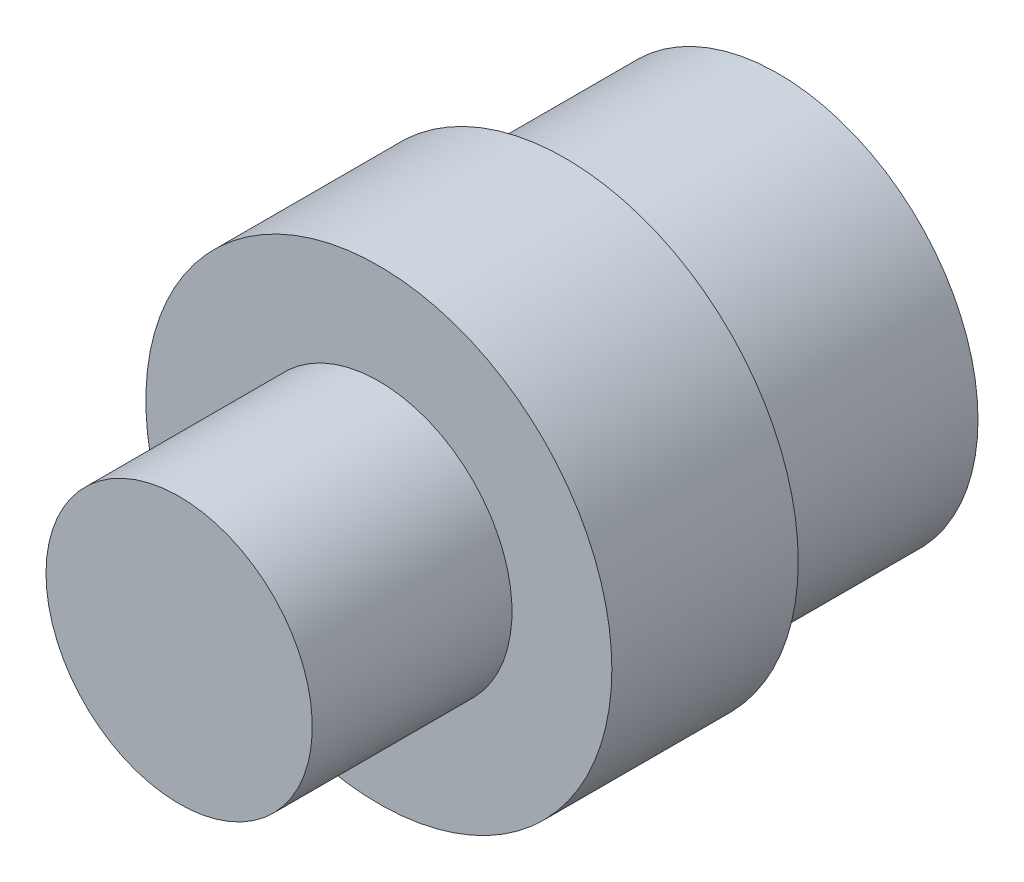
ISO-10303-21;
HEADER;
FILE_DESCRIPTION(('STEP AP214'),'2;1');
FILE_NAME('part.step','',(''),(''),'','','');
FILE_SCHEMA(('AUTOMOTIVE_DESIGN { 1 0 10303 214 1 1 1 1 }'));
ENDSEC;
DATA;
#1=APPLICATION_CONTEXT('core data for automotive mechanical design processes');
#2=APPLICATION_PROTOCOL_DEFINITION('international standard','automotive_design',2000,#1);
#3=PRODUCT_CONTEXT('',#1,'mechanical');
#4=PRODUCT('Part','Part','',(#3));
#5=PRODUCT_RELATED_PRODUCT_CATEGORY('part','',(#4));
#6=PRODUCT_DEFINITION_FORMATION('','',#4);
#7=PRODUCT_DEFINITION_CONTEXT('part definition',#1,'design');
#8=PRODUCT_DEFINITION('design','',#6,#7);
#9=PRODUCT_DEFINITION_SHAPE('','',#8);
#10=(LENGTH_UNIT() NAMED_UNIT(*) SI_UNIT(.MILLI.,.METRE.));
#11=(NAMED_UNIT(*) PLANE_ANGLE_UNIT() SI_UNIT($,.RADIAN.));
#12=(NAMED_UNIT(*) SI_UNIT($,.STERADIAN.) SOLID_ANGLE_UNIT());
#13=UNCERTAINTY_MEASURE_WITH_UNIT(LENGTH_MEASURE(1.E-05),#10,'distance_accuracy_value','');
#14=(GEOMETRIC_REPRESENTATION_CONTEXT(3) GLOBAL_UNCERTAINTY_ASSIGNED_CONTEXT((#13)) GLOBAL_UNIT_ASSIGNED_CONTEXT((#10,
#11,#12)) REPRESENTATION_CONTEXT('',''));
#15=CARTESIAN_POINT('',(0.,0.,0.));
#16=DIRECTION('',(0.,0.,1.));
#17=DIRECTION('',(1.,0.,0.));
#18=AXIS2_PLACEMENT_3D('',#15,#16,#17);
#19=CARTESIAN_POINT('',(0.,0.,9.525));
#20=DIRECTION('',(0.,0.,-1.));
#21=DIRECTION('',(-1.,0.,0.));
#22=AXIS2_PLACEMENT_3D('',#19,#20,#21);
#23=CYLINDRICAL_SURFACE('',#22,6.35);
#24=CARTESIAN_POINT('',(0.,0.,9.525));
#25=DIRECTION('',(0.,0.,1.));
#26=DIRECTION('',(1.,0.,0.));
#27=AXIS2_PLACEMENT_3D('',#24,#25,#26);
#28=CIRCLE('',#27,6.35);
#29=CARTESIAN_POINT('',(-6.35,0.,9.525));
#30=VERTEX_POINT('',#29);
#31=EDGE_CURVE('E50',#30,#30,#28,.T.);
#32=CARTESIAN_POINT('',(0.,0.,0.));
#33=DIRECTION('',(0.,0.,-1.));
#34=DIRECTION('',(-1.,0.,0.));
#35=AXIS2_PLACEMENT_3D('',#32,#33,#34);
#36=CIRCLE('',#35,6.35);
#37=CARTESIAN_POINT('',(-6.35,0.,0.));
#38=VERTEX_POINT('',#37);
#39=EDGE_CURVE('E54',#38,#38,#36,.T.);
#40=CARTESIAN_POINT('',(-6.35,0.,9.525));
#41=CARTESIAN_POINT('',(-6.35,0.,9.42578125));
#42=CARTESIAN_POINT('',(-6.35,0.,9.3265625));
#43=CARTESIAN_POINT('',(-6.35,0.,9.128125));
#44=CARTESIAN_POINT('',(-6.35,0.,9.02890625));
#45=CARTESIAN_POINT('',(-6.35,0.,8.83046875));
#46=CARTESIAN_POINT('',(-6.35,0.,8.73125));
#47=CARTESIAN_POINT('',(-6.35,0.,8.5328125));
#48=CARTESIAN_POINT('',(-6.35,0.,8.43359375));
#49=CARTESIAN_POINT('',(-6.35,0.,8.23515625));
#50=CARTESIAN_POINT('',(-6.35,0.,8.1359375));
#51=CARTESIAN_POINT('',(-6.35,0.,7.9375));
#52=CARTESIAN_POINT('',(-6.35,0.,7.83828125));
#53=CARTESIAN_POINT('',(-6.35,0.,7.63984375));
#54=CARTESIAN_POINT('',(-6.35,0.,7.540625));
#55=CARTESIAN_POINT('',(-6.35,0.,7.3421875));
#56=CARTESIAN_POINT('',(-6.35,0.,7.24296875));
#57=CARTESIAN_POINT('',(-6.35,0.,7.04453125));
#58=CARTESIAN_POINT('',(-6.35,0.,6.9453125));
#59=CARTESIAN_POINT('',(-6.35,0.,6.746875));
#60=CARTESIAN_POINT('',(-6.35,0.,6.64765625));
#61=CARTESIAN_POINT('',(-6.35,0.,6.44921875));
#62=CARTESIAN_POINT('',(-6.35,0.,6.35));
#63=CARTESIAN_POINT('',(-6.35,0.,6.1515625));
#64=CARTESIAN_POINT('',(-6.35,0.,6.05234375));
#65=CARTESIAN_POINT('',(-6.35,0.,5.85390625));
#66=CARTESIAN_POINT('',(-6.35,0.,5.7546875));
#67=CARTESIAN_POINT('',(-6.35,0.,5.55625));
#68=CARTESIAN_POINT('',(-6.35,0.,5.45703125));
#69=CARTESIAN_POINT('',(-6.35,0.,5.25859375));
#70=CARTESIAN_POINT('',(-6.35,0.,5.159375));
#71=CARTESIAN_POINT('',(-6.35,0.,4.9609375));
#72=CARTESIAN_POINT('',(-6.35,0.,4.86171875));
#73=CARTESIAN_POINT('',(-6.35,0.,4.66328125));
#74=CARTESIAN_POINT('',(-6.35,0.,4.5640625));
#75=CARTESIAN_POINT('',(-6.35,0.,4.365625));
#76=CARTESIAN_POINT('',(-6.35,0.,4.26640625));
#77=CARTESIAN_POINT('',(-6.35,0.,4.06796875));
#78=CARTESIAN_POINT('',(-6.35,0.,3.96875));
#79=CARTESIAN_POINT('',(-6.35,0.,3.7703125));
#80=CARTESIAN_POINT('',(-6.35,0.,3.67109375));
#81=CARTESIAN_POINT('',(-6.35,0.,3.47265625));
#82=CARTESIAN_POINT('',(-6.35,0.,3.3734375));
#83=CARTESIAN_POINT('',(-6.35,0.,3.175));
#84=CARTESIAN_POINT('',(-6.35,0.,3.07578125));
#85=CARTESIAN_POINT('',(-6.35,0.,2.87734375));
#86=CARTESIAN_POINT('',(-6.35,0.,2.778125));
#87=CARTESIAN_POINT('',(-6.35,0.,2.5796875));
#88=CARTESIAN_POINT('',(-6.35,0.,2.48046875));
#89=CARTESIAN_POINT('',(-6.35,0.,2.28203125));
#90=CARTESIAN_POINT('',(-6.35,0.,2.1828125));
#91=CARTESIAN_POINT('',(-6.35,0.,1.984375));
#92=CARTESIAN_POINT('',(-6.35,0.,1.88515625));
#93=CARTESIAN_POINT('',(-6.35,0.,1.68671875));
#94=CARTESIAN_POINT('',(-6.35,0.,1.5875));
#95=CARTESIAN_POINT('',(-6.35,0.,1.3890625));
#96=CARTESIAN_POINT('',(-6.35,0.,1.28984375));
#97=CARTESIAN_POINT('',(-6.35,0.,1.09140625));
#98=CARTESIAN_POINT('',(-6.35,0.,0.992187500000001));
#99=CARTESIAN_POINT('',(-6.35,0.,0.793750000000001));
#100=CARTESIAN_POINT('',(-6.35,0.,0.69453125));
#101=CARTESIAN_POINT('',(-6.35,0.,0.49609375));
#102=CARTESIAN_POINT('',(-6.35,0.,0.396875));
#103=CARTESIAN_POINT('',(-6.35,0.,0.1984375));
#104=CARTESIAN_POINT('',(-6.35,0.,0.0992187500000001));
#105=CARTESIAN_POINT('',(-6.35,0.,0.));
#106=B_SPLINE_CURVE_WITH_KNOTS('',3,(#40,#41,#42,#43,#44,#45,#46,#47,#48,#49,#50,#51,#52,#53,
#54,#55,#56,#57,#58,#59,#60,#61,#62,#63,#64,#65,#66,#67,#68,#69,#70,#71,#72,#73,#74,#75,#76,#77,
#78,#79,#80,#81,#82,#83,#84,#85,#86,#87,#88,#89,#90,#91,#92,#93,#94,#95,#96,#97,#98,#99,#100,
#101,#102,#103,#104,#105),.UNSPECIFIED.,.F.,.F.,(4,2,2,2,2,2,2,2,2,2,2,2,2,2,2,2,2,2,2,2,2,2,2,
2,2,2,2,2,2,2,2,2,4),(0.,0.297656249999998,0.595312499999999,0.892968749999999,1.190625,
1.48828125,1.7859375,2.08359375,2.38125,2.67890625,2.9765625,3.27421875,3.571875,3.86953125,
4.1671875,4.46484375,4.7625,5.06015625,5.3578125,5.65546875,5.953125,6.25078125,6.5484375,
6.84609375,7.14375,7.44140625,7.7390625,8.03671875,8.334375,8.63203125,8.9296875,9.22734375,
9.525),.UNSPECIFIED.);
#107=EDGE_CURVE('BSEAM44',#30,#38,#106,.T.);
#108=ORIENTED_EDGE('',*,*,#31,.F.);
#109=ORIENTED_EDGE('',*,*,#39,.F.);
#110=ORIENTED_EDGE('',*,*,#107,.T.);
#111=ORIENTED_EDGE('',*,*,#107,.F.);
#112=EDGE_LOOP('',(#108,#110,#109,#111));
#113=FACE_BOUND('',#112,.T.);
#114=ADVANCED_FACE('F44',(#113),#23,.T.);
#115=CARTESIAN_POINT('',(0.,0.,9.525));
#116=DIRECTION('',(0.,0.,1.));
#117=DIRECTION('',(1.,0.,0.));
#118=AXIS2_PLACEMENT_3D('',#115,#116,#117);
#119=PLANE('',#118);
#120=ORIENTED_EDGE('',*,*,#31,.T.);
#121=EDGE_LOOP('',(#120));
#122=FACE_BOUND('',#121,.T.);
#123=ADVANCED_FACE('F89',(#122),#119,.T.);
#124=CARTESIAN_POINT('',(0.,0.,0.));
#125=DIRECTION('',(0.,0.,-1.));
#126=DIRECTION('',(-1.,0.,0.));
#127=AXIS2_PLACEMENT_3D('',#124,#125,#126);
#128=PLANE('',#127);
#129=ORIENTED_EDGE('',*,*,#39,.T.);
#130=EDGE_LOOP('',(#129));
#131=FACE_BOUND('',#130,.T.);
#132=CARTESIAN_POINT('',(0.,0.,0.));
#133=DIRECTION('',(0.,0.,1.));
#134=DIRECTION('',(1.,0.,0.));
#135=AXIS2_PLACEMENT_3D('',#132,#133,#134);
#136=CIRCLE('',#135,11.1125);
#137=CARTESIAN_POINT('',(11.1125,0.,0.));
#138=VERTEX_POINT('',#137);
#139=EDGE_CURVE('E66',#138,#138,#136,.T.);
#140=ORIENTED_EDGE('',*,*,#139,.T.);
#141=EDGE_LOOP('',(#140));
#142=FACE_BOUND('',#141,.T.);
#143=ADVANCED_FACE('F70',(#131,#142),#128,.F.);
#144=CARTESIAN_POINT('',(0.,0.,-8.89));
#145=DIRECTION('',(0.,0.,1.));
#146=DIRECTION('',(1.,0.,0.));
#147=AXIS2_PLACEMENT_3D('',#144,#145,#146);
#148=PLANE('',#147);
#149=CARTESIAN_POINT('',(0.,0.,-8.89));
#150=DIRECTION('',(0.,0.,1.));
#151=DIRECTION('',(1.,0.,0.));
#152=AXIS2_PLACEMENT_3D('',#149,#150,#151);
#153=CIRCLE('',#152,11.1125);
#154=CARTESIAN_POINT('',(11.1125,0.,-8.89));
#155=VERTEX_POINT('',#154);
#156=EDGE_CURVE('E63',#155,#155,#153,.T.);
#157=ORIENTED_EDGE('',*,*,#156,.F.);
#158=EDGE_LOOP('',(#157));
#159=FACE_BOUND('',#158,.T.);
#160=CARTESIAN_POINT('',(0.,0.,-8.89));
#161=DIRECTION('',(0.,0.,1.));
#162=DIRECTION('',(1.,0.,0.));
#163=AXIS2_PLACEMENT_3D('',#160,#161,#162);
#164=CIRCLE('',#163,9.525);
#165=CARTESIAN_POINT('',(9.525,0.,-8.89));
#166=VERTEX_POINT('',#165);
#167=EDGE_CURVE('E12',#166,#166,#164,.T.);
#168=ORIENTED_EDGE('',*,*,#167,.T.);
#169=EDGE_LOOP('',(#168));
#170=FACE_BOUND('',#169,.T.);
#171=ADVANCED_FACE('F75',(#159,#170),#148,.F.);
#172=CARTESIAN_POINT('',(0.,0.,-8.89));
#173=DIRECTION('',(0.,0.,1.));
#174=DIRECTION('',(1.,0.,0.));
#175=AXIS2_PLACEMENT_3D('',#172,#173,#174);
#176=CYLINDRICAL_SURFACE('',#175,11.1125);
#177=ORIENTED_EDGE('',*,*,#156,.T.);
#178=EDGE_LOOP('',(#177));
#179=FACE_BOUND('',#178,.T.);
#180=ORIENTED_EDGE('',*,*,#139,.F.);
#181=EDGE_LOOP('',(#180));
#182=FACE_BOUND('',#181,.T.);
#183=ADVANCED_FACE('F72',(#179,#182),#176,.T.);
#184=CARTESIAN_POINT('',(0.,0.,-19.05));
#185=DIRECTION('',(0.,0.,-1.));
#186=DIRECTION('',(-1.,0.,0.));
#187=AXIS2_PLACEMENT_3D('',#184,#185,#186);
#188=PLANE('',#187);
#189=CARTESIAN_POINT('',(0.,0.,-19.05));
#190=DIRECTION('',(0.,0.,-1.));
#191=DIRECTION('',(-1.,0.,0.));
#192=AXIS2_PLACEMENT_3D('',#189,#190,#191);
#193=CIRCLE('',#192,9.525);
#194=CARTESIAN_POINT('',(9.525,0.,-19.05));
#195=VERTEX_POINT('',#194);
#196=EDGE_CURVE('E58',#195,#195,#193,.T.);
#197=ORIENTED_EDGE('',*,*,#196,.T.);
#198=EDGE_LOOP('',(#197));
#199=FACE_BOUND('',#198,.T.);
#200=ADVANCED_FACE('F74',(#199),#188,.T.);
#201=CARTESIAN_POINT('',(0.,0.,-19.05));
#202=DIRECTION('',(0.,0.,1.));
#203=DIRECTION('',(1.,0.,0.));
#204=AXIS2_PLACEMENT_3D('',#201,#202,#203);
#205=CYLINDRICAL_SURFACE('',#204,9.525);
#206=CARTESIAN_POINT('',(9.525,0.,-19.05));
#207=CARTESIAN_POINT('',(9.525,0.,-18.9441666666667));
#208=CARTESIAN_POINT('',(9.525,0.,-18.8383333333333));
#209=CARTESIAN_POINT('',(9.525,0.,-18.6266666666667));
#210=CARTESIAN_POINT('',(9.525,0.,-18.5208333333333));
#211=CARTESIAN_POINT('',(9.525,0.,-18.3091666666667));
#212=CARTESIAN_POINT('',(9.525,0.,-18.2033333333333));
#213=CARTESIAN_POINT('',(9.525,0.,-17.9916666666667));
#214=CARTESIAN_POINT('',(9.525,0.,-17.8858333333333));
#215=CARTESIAN_POINT('',(9.525,0.,-17.6741666666667));
#216=CARTESIAN_POINT('',(9.525,0.,-17.5683333333333));
#217=CARTESIAN_POINT('',(9.525,0.,-17.3566666666667));
#218=CARTESIAN_POINT('',(9.525,0.,-17.2508333333333));
#219=CARTESIAN_POINT('',(9.525,0.,-17.0391666666667));
#220=CARTESIAN_POINT('',(9.525,0.,-16.9333333333333));
#221=CARTESIAN_POINT('',(9.525,0.,-16.7216666666667));
#222=CARTESIAN_POINT('',(9.525,0.,-16.6158333333333));
#223=CARTESIAN_POINT('',(9.525,0.,-16.4041666666667));
#224=CARTESIAN_POINT('',(9.525,0.,-16.2983333333333));
#225=CARTESIAN_POINT('',(9.525,0.,-16.0866666666667));
#226=CARTESIAN_POINT('',(9.525,0.,-15.9808333333333));
#227=CARTESIAN_POINT('',(9.525,0.,-15.7691666666667));
#228=CARTESIAN_POINT('',(9.525,0.,-15.6633333333333));
#229=CARTESIAN_POINT('',(9.525,0.,-15.4516666666667));
#230=CARTESIAN_POINT('',(9.525,0.,-15.3458333333333));
#231=CARTESIAN_POINT('',(9.525,0.,-15.1341666666667));
#232=CARTESIAN_POINT('',(9.525,0.,-15.0283333333333));
#233=CARTESIAN_POINT('',(9.525,0.,-14.8166666666667));
#234=CARTESIAN_POINT('',(9.525,0.,-14.7108333333333));
#235=CARTESIAN_POINT('',(9.525,0.,-14.4991666666667));
#236=CARTESIAN_POINT('',(9.525,0.,-14.3933333333333));
#237=CARTESIAN_POINT('',(9.525,0.,-14.1816666666667));
#238=CARTESIAN_POINT('',(9.525,0.,-14.0758333333333));
#239=CARTESIAN_POINT('',(9.525,0.,-13.8641666666667));
#240=CARTESIAN_POINT('',(9.525,0.,-13.7583333333333));
#241=CARTESIAN_POINT('',(9.525,0.,-13.5466666666667));
#242=CARTESIAN_POINT('',(9.525,0.,-13.4408333333333));
#243=CARTESIAN_POINT('',(9.525,0.,-13.2291666666667));
#244=CARTESIAN_POINT('',(9.525,0.,-13.1233333333333));
#245=CARTESIAN_POINT('',(9.525,0.,-12.9116666666667));
#246=CARTESIAN_POINT('',(9.525,0.,-12.8058333333333));
#247=CARTESIAN_POINT('',(9.525,0.,-12.5941666666667));
#248=CARTESIAN_POINT('',(9.525,0.,-12.4883333333333));
#249=CARTESIAN_POINT('',(9.525,0.,-12.2766666666667));
#250=CARTESIAN_POINT('',(9.525,0.,-12.1708333333333));
#251=CARTESIAN_POINT('',(9.525,0.,-11.9591666666667));
#252=CARTESIAN_POINT('',(9.525,0.,-11.8533333333333));
#253=CARTESIAN_POINT('',(9.525,0.,-11.6416666666667));
#254=CARTESIAN_POINT('',(9.525,0.,-11.5358333333333));
#255=CARTESIAN_POINT('',(9.525,0.,-11.3241666666667));
#256=CARTESIAN_POINT('',(9.525,0.,-11.2183333333333));
#257=CARTESIAN_POINT('',(9.525,0.,-11.0066666666667));
#258=CARTESIAN_POINT('',(9.525,0.,-10.9008333333333));
#259=CARTESIAN_POINT('',(9.525,0.,-10.6891666666667));
#260=CARTESIAN_POINT('',(9.525,0.,-10.5833333333333));
#261=CARTESIAN_POINT('',(9.525,0.,-10.3716666666667));
#262=CARTESIAN_POINT('',(9.525,0.,-10.2658333333333));
#263=CARTESIAN_POINT('',(9.525,0.,-10.0541666666667));
#264=CARTESIAN_POINT('',(9.525,0.,-9.94833333333333));
#265=CARTESIAN_POINT('',(9.525,0.,-9.73666666666667));
#266=CARTESIAN_POINT('',(9.525,0.,-9.63083333333333));
#267=CARTESIAN_POINT('',(9.525,0.,-9.41916666666667));
#268=CARTESIAN_POINT('',(9.525,0.,-9.31333333333333));
#269=CARTESIAN_POINT('',(9.525,0.,-9.10166666666667));
#270=CARTESIAN_POINT('',(9.525,0.,-8.99583333333333));
#271=CARTESIAN_POINT('',(9.525,0.,-8.89));
#272=B_SPLINE_CURVE_WITH_KNOTS('',3,(#206,#207,#208,#209,#210,#211,#212,#213,#214,#215,#216,
#217,#218,#219,#220,#221,#222,#223,#224,#225,#226,#227,#228,#229,#230,#231,#232,#233,#234,#235,
#236,#237,#238,#239,#240,#241,#242,#243,#244,#245,#246,#247,#248,#249,#250,#251,#252,#253,#254,
#255,#256,#257,#258,#259,#260,#261,#262,#263,#264,#265,#266,#267,#268,#269,#270,#271),
.UNSPECIFIED.,.F.,.F.,(4,2,2,2,2,2,2,2,2,2,2,2,2,2,2,2,2,2,2,2,2,2,2,2,2,2,2,2,2,2,2,2,4),(0.,
0.317500000000002,0.635,0.952500000000002,1.27,1.5875,1.905,2.2225,2.54,2.8575,3.175,3.4925,
3.81,4.1275,4.445,4.7625,5.08,5.3975,5.715,6.0325,6.35,6.6675,6.985,7.3025,7.62,7.9375,8.255,
8.5725,8.89,9.2075,9.525,9.8425,10.16),.UNSPECIFIED.);
#273=EDGE_CURVE('BSEAM82',#195,#166,#272,.T.);
#274=ORIENTED_EDGE('',*,*,#196,.F.);
#275=ORIENTED_EDGE('',*,*,#167,.F.);
#276=ORIENTED_EDGE('',*,*,#273,.T.);
#277=ORIENTED_EDGE('',*,*,#273,.F.);
#278=EDGE_LOOP('',(#274,#276,#275,#277));
#279=FACE_BOUND('',#278,.T.);
#280=ADVANCED_FACE('F82',(#279),#205,.T.);
#281=CLOSED_SHELL('',(#114,#123,#143,#171,#183,#200,#280));
#282=MANIFOLD_SOLID_BREP('B2',#281);
#283=ADVANCED_BREP_SHAPE_REPRESENTATION('',(#18,#282),#14);
#284=SHAPE_DEFINITION_REPRESENTATION(#9,#283);
ENDSEC;
END-ISO-10303-21;
